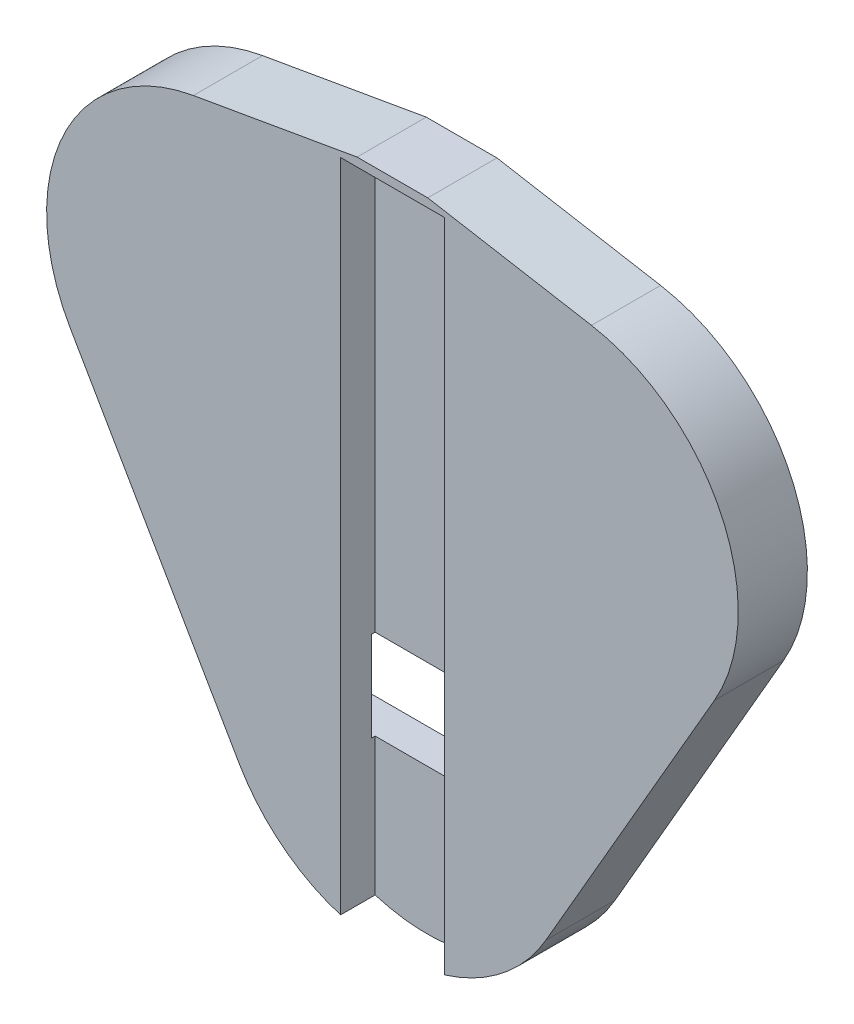
ISO-10303-21;
HEADER;
FILE_DESCRIPTION(('STEP AP214'),'2;1');
FILE_NAME('part.step','',(''),(''),'','','');
FILE_SCHEMA(('AUTOMOTIVE_DESIGN { 1 0 10303 214 1 1 1 1 }'));
ENDSEC;
DATA;
#1=APPLICATION_CONTEXT('core data for automotive mechanical design processes');
#2=APPLICATION_PROTOCOL_DEFINITION('international standard','automotive_design',2000,#1);
#3=PRODUCT_CONTEXT('',#1,'mechanical');
#4=PRODUCT('Part','Part','',(#3));
#5=PRODUCT_RELATED_PRODUCT_CATEGORY('part','',(#4));
#6=PRODUCT_DEFINITION_FORMATION('','',#4);
#7=PRODUCT_DEFINITION_CONTEXT('part definition',#1,'design');
#8=PRODUCT_DEFINITION('design','',#6,#7);
#9=PRODUCT_DEFINITION_SHAPE('','',#8);
#10=(LENGTH_UNIT() NAMED_UNIT(*) SI_UNIT(.MILLI.,.METRE.));
#11=(NAMED_UNIT(*) PLANE_ANGLE_UNIT() SI_UNIT($,.RADIAN.));
#12=(NAMED_UNIT(*) SI_UNIT($,.STERADIAN.) SOLID_ANGLE_UNIT());
#13=UNCERTAINTY_MEASURE_WITH_UNIT(LENGTH_MEASURE(1.E-05),#10,'distance_accuracy_value','');
#14=(GEOMETRIC_REPRESENTATION_CONTEXT(3) GLOBAL_UNCERTAINTY_ASSIGNED_CONTEXT((#13)) GLOBAL_UNIT_ASSIGNED_CONTEXT((#10,
#11,#12)) REPRESENTATION_CONTEXT('',''));
#15=CARTESIAN_POINT('',(0.,0.,0.));
#16=DIRECTION('',(0.,0.,1.));
#17=DIRECTION('',(1.,0.,0.));
#18=AXIS2_PLACEMENT_3D('',#15,#16,#17);
#19=CARTESIAN_POINT('',(0.,-21.5083302491977,-34.5));
#20=DIRECTION('',(0.,0.,1.));
#21=DIRECTION('',(1.,0.,0.));
#22=AXIS2_PLACEMENT_3D('',#19,#20,#21);
#23=PLANE('',#22);
#24=DIRECTION('',(-1.,0.,0.));
#25=VECTOR('',#24,1.);
#26=CARTESIAN_POINT('',(0.,-7.9,-34.5));
#27=LINE('',#26,#25);
#28=CARTESIAN_POINT('',(3.,-7.9,-34.5));
#29=VERTEX_POINT('',#28);
#30=CARTESIAN_POINT('',(-3.,-7.9,-34.5));
#31=VERTEX_POINT('',#30);
#32=EDGE_CURVE('E277',#29,#31,#27,.T.);
#33=ORIENTED_EDGE('',*,*,#32,.F.);
#34=DIRECTION('',(0.,1.,0.));
#35=VECTOR('',#34,1.);
#36=CARTESIAN_POINT('',(3.,-21.5083302491977,-34.5));
#37=LINE('',#36,#35);
#38=CARTESIAN_POINT('',(3.,16.8791651245989,-34.5));
#39=VERTEX_POINT('',#38);
#40=EDGE_CURVE('E296',#29,#39,#37,.T.);
#41=ORIENTED_EDGE('',*,*,#40,.T.);
#42=DIRECTION('',(-1.,0.,0.));
#43=VECTOR('',#42,1.);
#44=CARTESIAN_POINT('',(0.,16.8791651245989,-34.5));
#45=LINE('',#44,#43);
#46=CARTESIAN_POINT('',(-3.,16.8791651245989,-34.5));
#47=VERTEX_POINT('',#46);
#48=EDGE_CURVE('E286',#39,#47,#45,.T.);
#49=ORIENTED_EDGE('',*,*,#48,.T.);
#50=DIRECTION('',(0.,1.,0.));
#51=VECTOR('',#50,1.);
#52=CARTESIAN_POINT('',(-3.,-21.5083302491977,-34.5));
#53=LINE('',#52,#51);
#54=EDGE_CURVE('E289',#31,#47,#53,.T.);
#55=ORIENTED_EDGE('',*,*,#54,.F.);
#56=EDGE_LOOP('',(#33,#41,#49,#55));
#57=FACE_BOUND('',#56,.T.);
#58=ADVANCED_FACE('F39',(#57),#23,.T.);
#59=CARTESIAN_POINT('',(0.,-11.2583302491977,23.2874295558332));
#60=DIRECTION('',(0.,0.,-1.));
#61=DIRECTION('',(-1.,0.,0.));
#62=AXIS2_PLACEMENT_3D('',#59,#60,#61);
#63=CYLINDRICAL_SURFACE('',#62,10.25);
#64=CARTESIAN_POINT('',(0.,-11.2583302491977,-34.5));
#65=DIRECTION('',(0.,0.,1.));
#66=DIRECTION('',(1.,0.,0.));
#67=AXIS2_PLACEMENT_3D('',#64,#65,#66);
#68=CIRCLE('',#67,10.25);
#69=CARTESIAN_POINT('',(-3.,-21.059478141154,-34.5));
#70=VERTEX_POINT('',#69);
#71=CARTESIAN_POINT('',(3.,-21.059478141154,-34.5));
#72=VERTEX_POINT('',#71);
#73=EDGE_CURVE('E364',#70,#72,#68,.T.);
#74=ORIENTED_EDGE('',*,*,#73,.F.);
#75=DIRECTION('',(0.,0.,-1.));
#76=VECTOR('',#75,1.);
#77=CARTESIAN_POINT('',(-2.99999999999999,-21.059478141154,23.2874295558332));
#78=LINE('',#77,#76);
#79=CARTESIAN_POINT('',(-2.99999999999999,-21.059478141154,-32.5));
#80=VERTEX_POINT('',#79);
#81=EDGE_CURVE('E369',#70,#80,#78,.F.);
#82=ORIENTED_EDGE('',*,*,#81,.T.);
#83=CARTESIAN_POINT('',(0.,-11.2583302491977,-32.5));
#84=DIRECTION('',(0.,0.,1.));
#85=DIRECTION('',(1.,0.,0.));
#86=AXIS2_PLACEMENT_3D('',#83,#84,#85);
#87=CIRCLE('',#86,10.25);
#88=CARTESIAN_POINT('',(-8.8767603887905,-16.3833302491977,-32.5));
#89=VERTEX_POINT('',#88);
#90=EDGE_CURVE('E350',#89,#80,#87,.T.);
#91=ORIENTED_EDGE('',*,*,#90,.F.);
#92=DIRECTION('',(0.,0.,-1.));
#93=VECTOR('',#92,1.);
#94=CARTESIAN_POINT('',(-8.8767603887905,-16.3833302491977,23.2874295558332));
#95=LINE('',#94,#93);
#96=CARTESIAN_POINT('',(-8.8767603887905,-16.3833302491977,-36.5));
#97=VERTEX_POINT('',#96);
#98=EDGE_CURVE('E322',#89,#97,#95,.T.);
#99=ORIENTED_EDGE('',*,*,#98,.T.);
#100=CARTESIAN_POINT('',(0.,-11.2583302491977,-36.5));
#101=DIRECTION('',(0.,0.,1.));
#102=DIRECTION('',(1.,0.,0.));
#103=AXIS2_PLACEMENT_3D('',#100,#101,#102);
#104=CIRCLE('',#103,10.25);
#105=CARTESIAN_POINT('',(8.87676038879049,-16.3833302491977,-36.5));
#106=VERTEX_POINT('',#105);
#107=EDGE_CURVE('E318',#97,#106,#104,.T.);
#108=ORIENTED_EDGE('',*,*,#107,.T.);
#109=DIRECTION('',(0.,0.,-1.));
#110=VECTOR('',#109,1.);
#111=CARTESIAN_POINT('',(8.87676038879049,-16.3833302491977,23.2874295558332));
#112=LINE('',#111,#110);
#113=CARTESIAN_POINT('',(8.87676038879049,-16.3833302491977,-32.5));
#114=VERTEX_POINT('',#113);
#115=EDGE_CURVE('E326',#114,#106,#112,.T.);
#116=ORIENTED_EDGE('',*,*,#115,.F.);
#117=CARTESIAN_POINT('',(2.99999999999999,-21.059478141154,-32.5));
#118=VERTEX_POINT('',#117);
#119=EDGE_CURVE('E346',#118,#114,#87,.T.);
#120=ORIENTED_EDGE('',*,*,#119,.F.);
#121=DIRECTION('',(0.,0.,-1.));
#122=VECTOR('',#121,1.);
#123=CARTESIAN_POINT('',(2.99999999999999,-21.059478141154,23.2874295558332));
#124=LINE('',#123,#122);
#125=EDGE_CURVE('E366',#118,#72,#124,.T.);
#126=ORIENTED_EDGE('',*,*,#125,.T.);
#127=EDGE_LOOP('',(#74,#82,#91,#99,#108,#116,#120,#126));
#128=FACE_BOUND('',#127,.T.);
#129=ADVANCED_FACE('F394',(#128),#63,.T.);
#130=CARTESIAN_POINT('',(0.,0.,-32.5));
#131=DIRECTION('',(0.,0.,1.));
#132=DIRECTION('',(1.,0.,0.));
#133=AXIS2_PLACEMENT_3D('',#130,#131,#132);
#134=PLANE('',#133);
#135=DIRECTION('',(0.,1.,0.));
#136=VECTOR('',#135,1.);
#137=CARTESIAN_POINT('',(3.,0.,-32.5));
#138=LINE('',#137,#136);
#139=CARTESIAN_POINT('',(3.,16.8791651245989,-32.5));
#140=VERTEX_POINT('',#139);
#141=EDGE_CURVE('E301',#118,#140,#138,.T.);
#142=ORIENTED_EDGE('',*,*,#141,.F.);
#143=ORIENTED_EDGE('',*,*,#119,.T.);
#144=DIRECTION('',(0.5,0.866025403784439,0.));
#145=VECTOR('',#144,1.);
#146=CARTESIAN_POINT('',(13.7517603887905,-7.93958256229942,-32.5));
#147=LINE('',#146,#145);
#148=CARTESIAN_POINT('',(18.6267603887905,0.504165124598852,-32.5));
#149=VERTEX_POINT('',#148);
#150=EDGE_CURVE('E353',#114,#149,#147,.T.);
#151=ORIENTED_EDGE('',*,*,#150,.T.);
#152=CARTESIAN_POINT('',(9.75,5.62916512459887,-32.5));
#153=DIRECTION('',(0.,0.,1.));
#154=DIRECTION('',(1.,0.,0.));
#155=AXIS2_PLACEMENT_3D('',#152,#153,#154);
#156=CIRCLE('',#155,10.25);
#157=CARTESIAN_POINT('',(11.5123042934718,15.7265303045461,-32.5));
#158=VERTEX_POINT('',#157);
#159=EDGE_CURVE('E336',#149,#158,#156,.T.);
#160=ORIENTED_EDGE('',*,*,#159,.T.);
#161=DIRECTION('',(0.985108798043633,-0.171932126192369,0.));
#162=VECTOR('',#161,1.);
#163=CARTESIAN_POINT('',(3.00394280175114,17.2115040298747,-32.5));
#164=LINE('',#163,#162);
#165=CARTESIAN_POINT('',(2.04330546677387,17.3791651245989,-32.5));
#166=VERTEX_POINT('',#165);
#167=EDGE_CURVE('E316',#166,#158,#164,.T.);
#168=ORIENTED_EDGE('',*,*,#167,.F.);
#169=DIRECTION('',(1.,0.,0.));
#170=VECTOR('',#169,1.);
#171=CARTESIAN_POINT('',(0.,17.3791651245989,-32.5));
#172=LINE('',#171,#170);
#173=CARTESIAN_POINT('',(-2.04330546677387,17.3791651245989,-32.5));
#174=VERTEX_POINT('',#173);
#175=EDGE_CURVE('E307',#174,#166,#172,.T.);
#176=ORIENTED_EDGE('',*,*,#175,.F.);
#177=DIRECTION('',(-0.985108798043633,-0.17193212619237,0.));
#178=VECTOR('',#177,1.);
#179=CARTESIAN_POINT('',(-3.00394280175115,17.2115040298747,-32.5));
#180=LINE('',#179,#178);
#181=CARTESIAN_POINT('',(-11.5123042934718,15.7265303045461,-32.5));
#182=VERTEX_POINT('',#181);
#183=EDGE_CURVE('E303',#174,#182,#180,.T.);
#184=ORIENTED_EDGE('',*,*,#183,.T.);
#185=CARTESIAN_POINT('',(-9.75000000000001,5.62916512459888,-32.5));
#186=DIRECTION('',(0.,0.,1.));
#187=DIRECTION('',(1.,0.,0.));
#188=AXIS2_PLACEMENT_3D('',#185,#186,#187);
#189=CIRCLE('',#188,10.25);
#190=CARTESIAN_POINT('',(-18.6267603887905,0.504165124598869,-32.5));
#191=VERTEX_POINT('',#190);
#192=EDGE_CURVE('E344',#182,#191,#189,.T.);
#193=ORIENTED_EDGE('',*,*,#192,.T.);
#194=DIRECTION('',(-0.5,0.866025403784439,0.));
#195=VECTOR('',#194,1.);
#196=CARTESIAN_POINT('',(-13.7517603887905,-7.93958256229942,-32.5));
#197=LINE('',#196,#195);
#198=EDGE_CURVE('E321',#89,#191,#197,.T.);
#199=ORIENTED_EDGE('',*,*,#198,.F.);
#200=ORIENTED_EDGE('',*,*,#90,.T.);
#201=DIRECTION('',(0.,-1.,0.));
#202=VECTOR('',#201,1.);
#203=CARTESIAN_POINT('',(-3.,0.,-32.5));
#204=LINE('',#203,#202);
#205=CARTESIAN_POINT('',(-3.,16.8791651245989,-32.5));
#206=VERTEX_POINT('',#205);
#207=EDGE_CURVE('E295',#206,#80,#204,.T.);
#208=ORIENTED_EDGE('',*,*,#207,.F.);
#209=DIRECTION('',(1.,0.,0.));
#210=VECTOR('',#209,1.);
#211=CARTESIAN_POINT('',(0.,16.8791651245989,-32.5));
#212=LINE('',#211,#210);
#213=EDGE_CURVE('E372',#206,#140,#212,.T.);
#214=ORIENTED_EDGE('',*,*,#213,.T.);
#215=EDGE_LOOP('',(#142,#143,#151,#160,#168,#176,#184,#193,#199,#200,#208,#214));
#216=FACE_BOUND('',#215,.T.);
#217=ADVANCED_FACE('F41',(#216),#134,.T.);
#218=CARTESIAN_POINT('',(9.75,5.62916512459887,-36.5));
#219=DIRECTION('',(0.,0.,1.));
#220=DIRECTION('',(1.,0.,0.));
#221=AXIS2_PLACEMENT_3D('',#218,#219,#220);
#222=PLANE('',#221);
#223=DIRECTION('',(-1.,0.,0.));
#224=VECTOR('',#223,1.);
#225=CARTESIAN_POINT('',(0.,-13.1,-36.5));
#226=LINE('',#225,#224);
#227=CARTESIAN_POINT('',(9.1,-13.1,-36.5));
#228=VERTEX_POINT('',#227);
#229=CARTESIAN_POINT('',(-9.1,-13.1,-36.5));
#230=VERTEX_POINT('',#229);
#231=EDGE_CURVE('E243',#228,#230,#226,.T.);
#232=ORIENTED_EDGE('',*,*,#231,.F.);
#233=DIRECTION('',(0.,-1.,0.));
#234=VECTOR('',#233,1.);
#235=CARTESIAN_POINT('',(9.1,0.,-36.5));
#236=LINE('',#235,#234);
#237=CARTESIAN_POINT('',(9.1,-2.89999999999999,-36.5));
#238=VERTEX_POINT('',#237);
#239=EDGE_CURVE('E54',#238,#228,#236,.T.);
#240=ORIENTED_EDGE('',*,*,#239,.F.);
#241=DIRECTION('',(1.,0.,0.));
#242=VECTOR('',#241,1.);
#243=CARTESIAN_POINT('',(0.,-2.89999999999999,-36.5));
#244=LINE('',#243,#242);
#245=CARTESIAN_POINT('',(4.9,-2.89999999999999,-36.5));
#246=VERTEX_POINT('',#245);
#247=EDGE_CURVE('E224',#246,#238,#244,.T.);
#248=ORIENTED_EDGE('',*,*,#247,.F.);
#249=DIRECTION('',(0.,1.,0.));
#250=VECTOR('',#249,1.);
#251=CARTESIAN_POINT('',(4.9,0.,-36.5));
#252=LINE('',#251,#250);
#253=CARTESIAN_POINT('',(4.9,-7.9,-36.5));
#254=VERTEX_POINT('',#253);
#255=EDGE_CURVE('E227',#254,#246,#252,.T.);
#256=ORIENTED_EDGE('',*,*,#255,.F.);
#257=DIRECTION('',(1.,0.,0.));
#258=VECTOR('',#257,1.);
#259=CARTESIAN_POINT('',(0.,-7.9,-36.5));
#260=LINE('',#259,#258);
#261=CARTESIAN_POINT('',(-4.9,-7.9,-36.5));
#262=VERTEX_POINT('',#261);
#263=EDGE_CURVE('E254',#262,#254,#260,.T.);
#264=ORIENTED_EDGE('',*,*,#263,.F.);
#265=DIRECTION('',(0.,-1.,0.));
#266=VECTOR('',#265,1.);
#267=CARTESIAN_POINT('',(-4.9,0.,-36.5));
#268=LINE('',#267,#266);
#269=CARTESIAN_POINT('',(-4.9,-2.89999999999999,-36.5));
#270=VERTEX_POINT('',#269);
#271=EDGE_CURVE('E251',#270,#262,#268,.T.);
#272=ORIENTED_EDGE('',*,*,#271,.F.);
#273=DIRECTION('',(1.,0.,0.));
#274=VECTOR('',#273,1.);
#275=CARTESIAN_POINT('',(0.,-2.89999999999999,-36.5));
#276=LINE('',#275,#274);
#277=CARTESIAN_POINT('',(-9.1,-2.89999999999999,-36.5));
#278=VERTEX_POINT('',#277);
#279=EDGE_CURVE('E248',#278,#270,#276,.T.);
#280=ORIENTED_EDGE('',*,*,#279,.F.);
#281=DIRECTION('',(0.,1.,0.));
#282=VECTOR('',#281,1.);
#283=CARTESIAN_POINT('',(-9.1,0.,-36.5));
#284=LINE('',#283,#282);
#285=EDGE_CURVE('E245',#230,#278,#284,.T.);
#286=ORIENTED_EDGE('',*,*,#285,.F.);
#287=EDGE_LOOP('',(#232,#240,#248,#256,#264,#272,#280,#286));
#288=FACE_BOUND('',#287,.T.);
#289=DIRECTION('',(1.,0.,0.));
#290=VECTOR('',#289,1.);
#291=CARTESIAN_POINT('',(0.,17.3791651245989,-36.5));
#292=LINE('',#291,#290);
#293=CARTESIAN_POINT('',(-2.04330546677387,17.3791651245989,-36.5));
#294=VERTEX_POINT('',#293);
#295=CARTESIAN_POINT('',(2.04330546677387,17.3791651245989,-36.5));
#296=VERTEX_POINT('',#295);
#297=EDGE_CURVE('E333',#294,#296,#292,.T.);
#298=ORIENTED_EDGE('',*,*,#297,.T.);
#299=DIRECTION('',(0.985108798043633,-0.171932126192369,0.));
#300=VECTOR('',#299,1.);
#301=CARTESIAN_POINT('',(3.00394280175114,17.2115040298747,-36.5));
#302=LINE('',#301,#300);
#303=CARTESIAN_POINT('',(11.5123042934718,15.7265303045461,-36.5));
#304=VERTEX_POINT('',#303);
#305=EDGE_CURVE('E317',#296,#304,#302,.T.);
#306=ORIENTED_EDGE('',*,*,#305,.T.);
#307=CARTESIAN_POINT('',(9.75,5.62916512459887,-36.5));
#308=DIRECTION('',(0.,0.,1.));
#309=DIRECTION('',(1.,0.,0.));
#310=AXIS2_PLACEMENT_3D('',#307,#308,#309);
#311=CIRCLE('',#310,10.25);
#312=CARTESIAN_POINT('',(18.6267603887905,0.504165124598855,-36.5));
#313=VERTEX_POINT('',#312);
#314=EDGE_CURVE('E327',#313,#304,#311,.T.);
#315=ORIENTED_EDGE('',*,*,#314,.F.);
#316=DIRECTION('',(0.5,0.866025403784439,0.));
#317=VECTOR('',#316,1.);
#318=CARTESIAN_POINT('',(13.7517603887905,-7.93958256229942,-36.5));
#319=LINE('',#318,#317);
#320=EDGE_CURVE('E323',#106,#313,#319,.T.);
#321=ORIENTED_EDGE('',*,*,#320,.F.);
#322=ORIENTED_EDGE('',*,*,#107,.F.);
#323=DIRECTION('',(-0.5,0.866025403784439,0.));
#324=VECTOR('',#323,1.);
#325=CARTESIAN_POINT('',(-13.7517603887905,-7.93958256229942,-36.5));
#326=LINE('',#325,#324);
#327=CARTESIAN_POINT('',(-18.6267603887905,0.50416512459887,-36.5));
#328=VERTEX_POINT('',#327);
#329=EDGE_CURVE('E313',#97,#328,#326,.T.);
#330=ORIENTED_EDGE('',*,*,#329,.T.);
#331=CARTESIAN_POINT('',(-9.75000000000001,5.62916512459888,-36.5));
#332=DIRECTION('',(0.,0.,1.));
#333=DIRECTION('',(1.,0.,0.));
#334=AXIS2_PLACEMENT_3D('',#331,#332,#333);
#335=CIRCLE('',#334,10.25);
#336=CARTESIAN_POINT('',(-11.5123042934718,15.7265303045461,-36.5));
#337=VERTEX_POINT('',#336);
#338=EDGE_CURVE('E309',#337,#328,#335,.T.);
#339=ORIENTED_EDGE('',*,*,#338,.F.);
#340=DIRECTION('',(-0.985108798043633,-0.17193212619237,0.));
#341=VECTOR('',#340,1.);
#342=CARTESIAN_POINT('',(-3.00394280175115,17.2115040298747,-36.5));
#343=LINE('',#342,#341);
#344=EDGE_CURVE('E304',#294,#337,#343,.T.);
#345=ORIENTED_EDGE('',*,*,#344,.F.);
#346=EDGE_LOOP('',(#298,#306,#315,#321,#322,#330,#339,#345));
#347=FACE_BOUND('',#346,.T.);
#348=ADVANCED_FACE('F419',(#288,#347),#222,.F.);
#349=CARTESIAN_POINT('',(3.00394280175114,17.2115040298747,23.2874295558332));
#350=DIRECTION('',(0.171932126192369,0.985108798043633,0.));
#351=DIRECTION('',(-0.985108798043633,0.171932126192369,0.));
#352=AXIS2_PLACEMENT_3D('',#349,#350,#351);
#353=PLANE('',#352);
#354=DIRECTION('',(0.,0.,-1.));
#355=VECTOR('',#354,1.);
#356=CARTESIAN_POINT('',(2.04330546677387,17.3791651245989,23.2874295558332));
#357=LINE('',#356,#355);
#358=EDGE_CURVE('E342',#166,#296,#357,.T.);
#359=ORIENTED_EDGE('',*,*,#358,.F.);
#360=ORIENTED_EDGE('',*,*,#167,.T.);
#361=DIRECTION('',(0.,0.,-1.));
#362=VECTOR('',#361,1.);
#363=CARTESIAN_POINT('',(11.5123042934718,15.7265303045461,23.2874295558332));
#364=LINE('',#363,#362);
#365=EDGE_CURVE('E339',#158,#304,#364,.T.);
#366=ORIENTED_EDGE('',*,*,#365,.T.);
#367=ORIENTED_EDGE('',*,*,#305,.F.);
#368=EDGE_LOOP('',(#359,#360,#366,#367));
#369=FACE_BOUND('',#368,.T.);
#370=ADVANCED_FACE('F459',(#369),#353,.T.);
#371=CARTESIAN_POINT('',(9.75,5.62916512459887,23.2874295558332));
#372=DIRECTION('',(0.,0.,-1.));
#373=DIRECTION('',(-1.,0.,0.));
#374=AXIS2_PLACEMENT_3D('',#371,#372,#373);
#375=CYLINDRICAL_SURFACE('',#374,10.25);
#376=ORIENTED_EDGE('',*,*,#159,.F.);
#377=DIRECTION('',(0.,0.,-1.));
#378=VECTOR('',#377,1.);
#379=CARTESIAN_POINT('',(18.6267603887905,0.504165124598855,23.2874295558332));
#380=LINE('',#379,#378);
#381=EDGE_CURVE('E330',#149,#313,#380,.T.);
#382=ORIENTED_EDGE('',*,*,#381,.T.);
#383=ORIENTED_EDGE('',*,*,#314,.T.);
#384=ORIENTED_EDGE('',*,*,#365,.F.);
#385=EDGE_LOOP('',(#376,#382,#383,#384));
#386=FACE_BOUND('',#385,.T.);
#387=ADVANCED_FACE('F463',(#386),#375,.T.);
#388=CARTESIAN_POINT('',(13.7517603887905,-7.93958256229942,23.2874295558332));
#389=DIRECTION('',(-0.866025403784439,0.5,0.));
#390=DIRECTION('',(-0.5,-0.866025403784439,0.));
#391=AXIS2_PLACEMENT_3D('',#388,#389,#390);
#392=PLANE('',#391);
#393=ORIENTED_EDGE('',*,*,#150,.F.);
#394=ORIENTED_EDGE('',*,*,#115,.T.);
#395=ORIENTED_EDGE('',*,*,#320,.T.);
#396=ORIENTED_EDGE('',*,*,#381,.F.);
#397=EDGE_LOOP('',(#393,#394,#395,#396));
#398=FACE_BOUND('',#397,.T.);
#399=ADVANCED_FACE('F465',(#398),#392,.F.);
#400=CARTESIAN_POINT('',(-13.7517603887905,-7.93958256229942,23.2874295558332));
#401=DIRECTION('',(-0.866025403784439,-0.5,0.));
#402=DIRECTION('',(0.5,-0.866025403784439,0.));
#403=AXIS2_PLACEMENT_3D('',#400,#401,#402);
#404=PLANE('',#403);
#405=ORIENTED_EDGE('',*,*,#98,.F.);
#406=ORIENTED_EDGE('',*,*,#198,.T.);
#407=DIRECTION('',(0.,0.,-1.));
#408=VECTOR('',#407,1.);
#409=CARTESIAN_POINT('',(-18.6267603887905,0.50416512459887,23.2874295558332));
#410=LINE('',#409,#408);
#411=EDGE_CURVE('E349',#191,#328,#410,.T.);
#412=ORIENTED_EDGE('',*,*,#411,.T.);
#413=ORIENTED_EDGE('',*,*,#329,.F.);
#414=EDGE_LOOP('',(#405,#406,#412,#413));
#415=FACE_BOUND('',#414,.T.);
#416=ADVANCED_FACE('F443',(#415),#404,.T.);
#417=CARTESIAN_POINT('',(-9.75000000000001,5.62916512459888,23.2874295558332));
#418=DIRECTION('',(0.,0.,-1.));
#419=DIRECTION('',(-1.,0.,0.));
#420=AXIS2_PLACEMENT_3D('',#417,#418,#419);
#421=CYLINDRICAL_SURFACE('',#420,10.25);
#422=ORIENTED_EDGE('',*,*,#192,.F.);
#423=DIRECTION('',(0.,0.,-1.));
#424=VECTOR('',#423,1.);
#425=CARTESIAN_POINT('',(-11.5123042934718,15.7265303045461,23.2874295558332));
#426=LINE('',#425,#424);
#427=EDGE_CURVE('E312',#182,#337,#426,.T.);
#428=ORIENTED_EDGE('',*,*,#427,.T.);
#429=ORIENTED_EDGE('',*,*,#338,.T.);
#430=ORIENTED_EDGE('',*,*,#411,.F.);
#431=EDGE_LOOP('',(#422,#428,#429,#430));
#432=FACE_BOUND('',#431,.T.);
#433=ADVANCED_FACE('F447',(#432),#421,.T.);
#434=CARTESIAN_POINT('',(-3.00394280175115,17.2115040298747,23.2874295558332));
#435=DIRECTION('',(0.17193212619237,-0.985108798043633,0.));
#436=DIRECTION('',(0.985108798043633,0.17193212619237,0.));
#437=AXIS2_PLACEMENT_3D('',#434,#435,#436);
#438=PLANE('',#437);
#439=ORIENTED_EDGE('',*,*,#183,.F.);
#440=DIRECTION('',(0.,0.,-1.));
#441=VECTOR('',#440,1.);
#442=CARTESIAN_POINT('',(-2.04330546677387,17.3791651245989,23.2874295558332));
#443=LINE('',#442,#441);
#444=EDGE_CURVE('E308',#174,#294,#443,.T.);
#445=ORIENTED_EDGE('',*,*,#444,.T.);
#446=ORIENTED_EDGE('',*,*,#344,.T.);
#447=ORIENTED_EDGE('',*,*,#427,.F.);
#448=EDGE_LOOP('',(#439,#445,#446,#447));
#449=FACE_BOUND('',#448,.T.);
#450=ADVANCED_FACE('F490',(#449),#438,.F.);
#451=CARTESIAN_POINT('',(0.,17.3791651245989,23.2874295558332));
#452=DIRECTION('',(0.,1.,0.));
#453=DIRECTION('',(0.,0.,1.));
#454=AXIS2_PLACEMENT_3D('',#451,#452,#453);
#455=PLANE('',#454);
#456=ORIENTED_EDGE('',*,*,#444,.F.);
#457=ORIENTED_EDGE('',*,*,#175,.T.);
#458=ORIENTED_EDGE('',*,*,#358,.T.);
#459=ORIENTED_EDGE('',*,*,#297,.F.);
#460=EDGE_LOOP('',(#456,#457,#458,#459));
#461=FACE_BOUND('',#460,.T.);
#462=ADVANCED_FACE('F454',(#461),#455,.T.);
#463=DIRECTION('',(1.,0.,0.));
#464=VECTOR('',#463,1.);
#465=CARTESIAN_POINT('',(0.,-13.1,-34.5));
#466=LINE('',#465,#464);
#467=CARTESIAN_POINT('',(-3.,-13.1,-34.5));
#468=VERTEX_POINT('',#467);
#469=CARTESIAN_POINT('',(3.,-13.1,-34.5));
#470=VERTEX_POINT('',#469);
#471=EDGE_CURVE('E274',#468,#470,#466,.T.);
#472=ORIENTED_EDGE('',*,*,#471,.F.);
#473=EDGE_CURVE('E297',#70,#468,#53,.T.);
#474=ORIENTED_EDGE('',*,*,#473,.F.);
#475=ORIENTED_EDGE('',*,*,#73,.T.);
#476=EDGE_CURVE('E292',#72,#470,#37,.T.);
#477=ORIENTED_EDGE('',*,*,#476,.T.);
#478=EDGE_LOOP('',(#472,#474,#475,#477));
#479=FACE_BOUND('',#478,.T.);
#480=ADVANCED_FACE('F386',(#479),#23,.T.);
#481=CARTESIAN_POINT('',(2.99999999999999,-21.5083302491977,0.));
#482=DIRECTION('',(1.,0.,0.));
#483=DIRECTION('',(0.,0.,-1.));
#484=AXIS2_PLACEMENT_3D('',#481,#482,#483);
#485=PLANE('',#484);
#486=ORIENTED_EDGE('',*,*,#40,.F.);
#487=DIRECTION('',(0.,0.,1.));
#488=VECTOR('',#487,1.);
#489=CARTESIAN_POINT('',(2.99999999999999,-7.9,0.));
#490=LINE('',#489,#488);
#491=CARTESIAN_POINT('',(3.,-7.9,-34.3));
#492=VERTEX_POINT('',#491);
#493=EDGE_CURVE('E279',#29,#492,#490,.T.);
#494=ORIENTED_EDGE('',*,*,#493,.T.);
#495=DIRECTION('',(0.,1.,0.));
#496=VECTOR('',#495,1.);
#497=CARTESIAN_POINT('',(3.,-21.5083302491977,-34.3));
#498=LINE('',#497,#496);
#499=CARTESIAN_POINT('',(3.,-13.1,-34.3));
#500=VERTEX_POINT('',#499);
#501=EDGE_CURVE('E261',#500,#492,#498,.T.);
#502=ORIENTED_EDGE('',*,*,#501,.F.);
#503=DIRECTION('',(0.,0.,-1.));
#504=VECTOR('',#503,1.);
#505=CARTESIAN_POINT('',(2.99999999999999,-13.1,0.));
#506=LINE('',#505,#504);
#507=EDGE_CURVE('E215',#500,#470,#506,.T.);
#508=ORIENTED_EDGE('',*,*,#507,.T.);
#509=ORIENTED_EDGE('',*,*,#476,.F.);
#510=ORIENTED_EDGE('',*,*,#125,.F.);
#511=ORIENTED_EDGE('',*,*,#141,.T.);
#512=DIRECTION('',(0.,0.,1.));
#513=VECTOR('',#512,1.);
#514=CARTESIAN_POINT('',(2.99999999999999,16.8791651245989,0.));
#515=LINE('',#514,#513);
#516=EDGE_CURVE('E282',#39,#140,#515,.T.);
#517=ORIENTED_EDGE('',*,*,#516,.F.);
#518=EDGE_LOOP('',(#486,#494,#502,#508,#509,#510,#511,#517));
#519=FACE_BOUND('',#518,.T.);
#520=ADVANCED_FACE('F390',(#519),#485,.F.);
#521=CARTESIAN_POINT('',(-2.99999999999999,-21.5083302491977,0.));
#522=DIRECTION('',(-1.,0.,0.));
#523=DIRECTION('',(0.,0.,1.));
#524=AXIS2_PLACEMENT_3D('',#521,#522,#523);
#525=PLANE('',#524);
#526=DIRECTION('',(0.,-1.,0.));
#527=VECTOR('',#526,1.);
#528=CARTESIAN_POINT('',(-3.,-21.5083302491977,-34.3));
#529=LINE('',#528,#527);
#530=CARTESIAN_POINT('',(-3.,-7.9,-34.3));
#531=VERTEX_POINT('',#530);
#532=CARTESIAN_POINT('',(-3.,-13.1,-34.3));
#533=VERTEX_POINT('',#532);
#534=EDGE_CURVE('E375',#531,#533,#529,.T.);
#535=ORIENTED_EDGE('',*,*,#534,.F.);
#536=DIRECTION('',(0.,0.,-1.));
#537=VECTOR('',#536,1.);
#538=CARTESIAN_POINT('',(-2.99999999999999,-7.9,0.));
#539=LINE('',#538,#537);
#540=EDGE_CURVE('E11',#531,#31,#539,.T.);
#541=ORIENTED_EDGE('',*,*,#540,.T.);
#542=ORIENTED_EDGE('',*,*,#54,.T.);
#543=DIRECTION('',(0.,0.,-1.));
#544=VECTOR('',#543,1.);
#545=CARTESIAN_POINT('',(-2.99999999999999,16.8791651245989,0.));
#546=LINE('',#545,#544);
#547=EDGE_CURVE('E283',#206,#47,#546,.T.);
#548=ORIENTED_EDGE('',*,*,#547,.F.);
#549=ORIENTED_EDGE('',*,*,#207,.T.);
#550=ORIENTED_EDGE('',*,*,#81,.F.);
#551=ORIENTED_EDGE('',*,*,#473,.T.);
#552=DIRECTION('',(0.,0.,1.));
#553=VECTOR('',#552,1.);
#554=CARTESIAN_POINT('',(-2.99999999999999,-13.1,0.));
#555=LINE('',#554,#553);
#556=EDGE_CURVE('E47',#468,#533,#555,.T.);
#557=ORIENTED_EDGE('',*,*,#556,.T.);
#558=EDGE_LOOP('',(#535,#541,#542,#548,#549,#550,#551,#557));
#559=FACE_BOUND('',#558,.T.);
#560=ADVANCED_FACE('F379',(#559),#525,.F.);
#561=CARTESIAN_POINT('',(0.,16.8791651245989,-92.2874295558332));
#562=DIRECTION('',(0.,-1.,0.));
#563=DIRECTION('',(0.,0.,-1.));
#564=AXIS2_PLACEMENT_3D('',#561,#562,#563);
#565=PLANE('',#564);
#566=ORIENTED_EDGE('',*,*,#547,.T.);
#567=ORIENTED_EDGE('',*,*,#48,.F.);
#568=ORIENTED_EDGE('',*,*,#516,.T.);
#569=ORIENTED_EDGE('',*,*,#213,.F.);
#570=EDGE_LOOP('',(#566,#567,#568,#569));
#571=FACE_BOUND('',#570,.T.);
#572=ADVANCED_FACE('F403',(#571),#565,.T.);
#573=CARTESIAN_POINT('',(0.,-7.9,-34.3));
#574=DIRECTION('',(0.,1.,0.));
#575=DIRECTION('',(0.,0.,1.));
#576=AXIS2_PLACEMENT_3D('',#573,#574,#575);
#577=PLANE('',#576);
#578=ORIENTED_EDGE('',*,*,#32,.T.);
#579=ORIENTED_EDGE('',*,*,#540,.F.);
#580=DIRECTION('',(1.,0.,0.));
#581=VECTOR('',#580,1.);
#582=CARTESIAN_POINT('',(0.,-7.9,-34.3));
#583=LINE('',#582,#581);
#584=CARTESIAN_POINT('',(-4.9,-7.9,-34.3));
#585=VERTEX_POINT('',#584);
#586=EDGE_CURVE('E62',#585,#531,#583,.T.);
#587=ORIENTED_EDGE('',*,*,#586,.F.);
#588=DIRECTION('',(0.,0.,-1.));
#589=VECTOR('',#588,1.);
#590=CARTESIAN_POINT('',(-4.9,-7.9,-34.3));
#591=LINE('',#590,#589);
#592=EDGE_CURVE('E266',#585,#262,#591,.T.);
#593=ORIENTED_EDGE('',*,*,#592,.T.);
#594=ORIENTED_EDGE('',*,*,#263,.T.);
#595=DIRECTION('',(0.,0.,-1.));
#596=VECTOR('',#595,1.);
#597=CARTESIAN_POINT('',(4.9,-7.9,-34.3));
#598=LINE('',#597,#596);
#599=CARTESIAN_POINT('',(4.9,-7.9,-34.3));
#600=VERTEX_POINT('',#599);
#601=EDGE_CURVE('E264',#600,#254,#598,.T.);
#602=ORIENTED_EDGE('',*,*,#601,.F.);
#603=EDGE_CURVE('E237',#492,#600,#583,.T.);
#604=ORIENTED_EDGE('',*,*,#603,.F.);
#605=ORIENTED_EDGE('',*,*,#493,.F.);
#606=EDGE_LOOP('',(#578,#579,#587,#593,#594,#602,#604,#605));
#607=FACE_BOUND('',#606,.T.);
#608=ADVANCED_FACE('F410',(#607),#577,.F.);
#609=CARTESIAN_POINT('',(0.,-13.1,-34.3));
#610=DIRECTION('',(0.,-1.,0.));
#611=DIRECTION('',(0.,0.,-1.));
#612=AXIS2_PLACEMENT_3D('',#609,#610,#611);
#613=PLANE('',#612);
#614=DIRECTION('',(-1.,0.,0.));
#615=VECTOR('',#614,1.);
#616=CARTESIAN_POINT('',(0.,-13.1,-34.3));
#617=LINE('',#616,#615);
#618=CARTESIAN_POINT('',(9.1,-13.1,-34.3));
#619=VERTEX_POINT('',#618);
#620=EDGE_CURVE('E212',#619,#500,#617,.T.);
#621=ORIENTED_EDGE('',*,*,#620,.F.);
#622=DIRECTION('',(0.,0.,-1.));
#623=VECTOR('',#622,1.);
#624=CARTESIAN_POINT('',(9.1,-13.1,-34.3));
#625=LINE('',#624,#623);
#626=EDGE_CURVE('E199',#619,#228,#625,.T.);
#627=ORIENTED_EDGE('',*,*,#626,.T.);
#628=ORIENTED_EDGE('',*,*,#231,.T.);
#629=DIRECTION('',(0.,0.,-1.));
#630=VECTOR('',#629,1.);
#631=CARTESIAN_POINT('',(-9.1,-13.1,-34.3));
#632=LINE('',#631,#630);
#633=CARTESIAN_POINT('',(-9.1,-13.1,-34.3));
#634=VERTEX_POINT('',#633);
#635=EDGE_CURVE('E208',#634,#230,#632,.T.);
#636=ORIENTED_EDGE('',*,*,#635,.F.);
#637=EDGE_CURVE('E219',#533,#634,#617,.T.);
#638=ORIENTED_EDGE('',*,*,#637,.F.);
#639=ORIENTED_EDGE('',*,*,#556,.F.);
#640=ORIENTED_EDGE('',*,*,#471,.T.);
#641=ORIENTED_EDGE('',*,*,#507,.F.);
#642=EDGE_LOOP('',(#621,#627,#628,#636,#638,#639,#640,#641));
#643=FACE_BOUND('',#642,.T.);
#644=ADVANCED_FACE('F213',(#643),#613,.F.);
#645=CARTESIAN_POINT('',(0.,0.,-34.3));
#646=DIRECTION('',(0.,0.,-1.));
#647=DIRECTION('',(-1.,0.,0.));
#648=AXIS2_PLACEMENT_3D('',#645,#646,#647);
#649=PLANE('',#648);
#650=ORIENTED_EDGE('',*,*,#501,.T.);
#651=ORIENTED_EDGE('',*,*,#603,.T.);
#652=DIRECTION('',(0.,1.,0.));
#653=VECTOR('',#652,1.);
#654=CARTESIAN_POINT('',(4.9,0.,-34.3));
#655=LINE('',#654,#653);
#656=CARTESIAN_POINT('',(4.9,-2.89999999999999,-34.3));
#657=VERTEX_POINT('',#656);
#658=EDGE_CURVE('E239',#600,#657,#655,.T.);
#659=ORIENTED_EDGE('',*,*,#658,.T.);
#660=DIRECTION('',(1.,0.,0.));
#661=VECTOR('',#660,1.);
#662=CARTESIAN_POINT('',(0.,-2.89999999999999,-34.3));
#663=LINE('',#662,#661);
#664=CARTESIAN_POINT('',(9.1,-2.89999999999999,-34.3));
#665=VERTEX_POINT('',#664);
#666=EDGE_CURVE('E209',#657,#665,#663,.T.);
#667=ORIENTED_EDGE('',*,*,#666,.T.);
#668=DIRECTION('',(0.,-1.,0.));
#669=VECTOR('',#668,1.);
#670=CARTESIAN_POINT('',(9.1,0.,-34.3));
#671=LINE('',#670,#669);
#672=EDGE_CURVE('E203',#665,#619,#671,.T.);
#673=ORIENTED_EDGE('',*,*,#672,.T.);
#674=ORIENTED_EDGE('',*,*,#620,.T.);
#675=EDGE_LOOP('',(#650,#651,#659,#667,#673,#674));
#676=FACE_BOUND('',#675,.T.);
#677=ADVANCED_FACE('F221',(#676),#649,.T.);
#678=ORIENTED_EDGE('',*,*,#534,.T.);
#679=ORIENTED_EDGE('',*,*,#637,.T.);
#680=DIRECTION('',(0.,1.,0.));
#681=VECTOR('',#680,1.);
#682=CARTESIAN_POINT('',(-9.1,0.,-34.3));
#683=LINE('',#682,#681);
#684=CARTESIAN_POINT('',(-9.1,-2.89999999999999,-34.3));
#685=VERTEX_POINT('',#684);
#686=EDGE_CURVE('E218',#634,#685,#683,.T.);
#687=ORIENTED_EDGE('',*,*,#686,.T.);
#688=DIRECTION('',(1.,0.,0.));
#689=VECTOR('',#688,1.);
#690=CARTESIAN_POINT('',(0.,-2.89999999999999,-34.3));
#691=LINE('',#690,#689);
#692=CARTESIAN_POINT('',(-4.9,-2.89999999999999,-34.3));
#693=VERTEX_POINT('',#692);
#694=EDGE_CURVE('E232',#685,#693,#691,.T.);
#695=ORIENTED_EDGE('',*,*,#694,.T.);
#696=DIRECTION('',(0.,-1.,0.));
#697=VECTOR('',#696,1.);
#698=CARTESIAN_POINT('',(-4.9,0.,-34.3));
#699=LINE('',#698,#697);
#700=EDGE_CURVE('E235',#693,#585,#699,.T.);
#701=ORIENTED_EDGE('',*,*,#700,.T.);
#702=ORIENTED_EDGE('',*,*,#586,.T.);
#703=EDGE_LOOP('',(#678,#679,#687,#695,#701,#702));
#704=FACE_BOUND('',#703,.T.);
#705=ADVANCED_FACE('F427',(#704),#649,.T.);
#706=CARTESIAN_POINT('',(9.1,0.,-34.3));
#707=DIRECTION('',(1.,0.,0.));
#708=DIRECTION('',(0.,0.,-1.));
#709=AXIS2_PLACEMENT_3D('',#706,#707,#708);
#710=PLANE('',#709);
#711=ORIENTED_EDGE('',*,*,#239,.T.);
#712=ORIENTED_EDGE('',*,*,#626,.F.);
#713=ORIENTED_EDGE('',*,*,#672,.F.);
#714=DIRECTION('',(0.,0.,-1.));
#715=VECTOR('',#714,1.);
#716=CARTESIAN_POINT('',(9.1,-2.89999999999999,-34.3));
#717=LINE('',#716,#715);
#718=EDGE_CURVE('E259',#665,#238,#717,.T.);
#719=ORIENTED_EDGE('',*,*,#718,.T.);
#720=EDGE_LOOP('',(#711,#712,#713,#719));
#721=FACE_BOUND('',#720,.T.);
#722=ADVANCED_FACE('F201',(#721),#710,.F.);
#723=CARTESIAN_POINT('',(0.,-2.89999999999999,-34.3));
#724=DIRECTION('',(0.,1.,0.));
#725=DIRECTION('',(0.,0.,1.));
#726=AXIS2_PLACEMENT_3D('',#723,#724,#725);
#727=PLANE('',#726);
#728=ORIENTED_EDGE('',*,*,#247,.T.);
#729=ORIENTED_EDGE('',*,*,#718,.F.);
#730=ORIENTED_EDGE('',*,*,#666,.F.);
#731=DIRECTION('',(0.,0.,-1.));
#732=VECTOR('',#731,1.);
#733=CARTESIAN_POINT('',(4.9,-2.89999999999999,-34.3));
#734=LINE('',#733,#732);
#735=EDGE_CURVE('E262',#657,#246,#734,.T.);
#736=ORIENTED_EDGE('',*,*,#735,.T.);
#737=EDGE_LOOP('',(#728,#729,#730,#736));
#738=FACE_BOUND('',#737,.T.);
#739=ADVANCED_FACE('F415',(#738),#727,.F.);
#740=CARTESIAN_POINT('',(4.9,0.,-34.3));
#741=DIRECTION('',(-1.,0.,0.));
#742=DIRECTION('',(0.,0.,1.));
#743=AXIS2_PLACEMENT_3D('',#740,#741,#742);
#744=PLANE('',#743);
#745=ORIENTED_EDGE('',*,*,#255,.T.);
#746=ORIENTED_EDGE('',*,*,#735,.F.);
#747=ORIENTED_EDGE('',*,*,#658,.F.);
#748=ORIENTED_EDGE('',*,*,#601,.T.);
#749=EDGE_LOOP('',(#745,#746,#747,#748));
#750=FACE_BOUND('',#749,.T.);
#751=ADVANCED_FACE('F594',(#750),#744,.F.);
#752=CARTESIAN_POINT('',(-4.9,0.,-34.3));
#753=DIRECTION('',(1.,0.,0.));
#754=DIRECTION('',(0.,0.,-1.));
#755=AXIS2_PLACEMENT_3D('',#752,#753,#754);
#756=PLANE('',#755);
#757=ORIENTED_EDGE('',*,*,#271,.T.);
#758=ORIENTED_EDGE('',*,*,#592,.F.);
#759=ORIENTED_EDGE('',*,*,#700,.F.);
#760=DIRECTION('',(0.,0.,-1.));
#761=VECTOR('',#760,1.);
#762=CARTESIAN_POINT('',(-4.9,-2.89999999999999,-34.3));
#763=LINE('',#762,#761);
#764=EDGE_CURVE('E268',#693,#270,#763,.T.);
#765=ORIENTED_EDGE('',*,*,#764,.T.);
#766=EDGE_LOOP('',(#757,#758,#759,#765));
#767=FACE_BOUND('',#766,.T.);
#768=ADVANCED_FACE('F433',(#767),#756,.F.);
#769=CARTESIAN_POINT('',(0.,-2.89999999999999,-34.3));
#770=DIRECTION('',(0.,1.,0.));
#771=DIRECTION('',(0.,0.,1.));
#772=AXIS2_PLACEMENT_3D('',#769,#770,#771);
#773=PLANE('',#772);
#774=ORIENTED_EDGE('',*,*,#279,.T.);
#775=ORIENTED_EDGE('',*,*,#764,.F.);
#776=ORIENTED_EDGE('',*,*,#694,.F.);
#777=DIRECTION('',(0.,0.,-1.));
#778=VECTOR('',#777,1.);
#779=CARTESIAN_POINT('',(-9.1,-2.89999999999999,-34.3));
#780=LINE('',#779,#778);
#781=EDGE_CURVE('E270',#685,#278,#780,.T.);
#782=ORIENTED_EDGE('',*,*,#781,.T.);
#783=EDGE_LOOP('',(#774,#775,#776,#782));
#784=FACE_BOUND('',#783,.T.);
#785=ADVANCED_FACE('F430',(#784),#773,.F.);
#786=CARTESIAN_POINT('',(-9.1,0.,-34.3));
#787=DIRECTION('',(-1.,0.,0.));
#788=DIRECTION('',(0.,0.,1.));
#789=AXIS2_PLACEMENT_3D('',#786,#787,#788);
#790=PLANE('',#789);
#791=ORIENTED_EDGE('',*,*,#285,.T.);
#792=ORIENTED_EDGE('',*,*,#781,.F.);
#793=ORIENTED_EDGE('',*,*,#686,.F.);
#794=ORIENTED_EDGE('',*,*,#635,.T.);
#795=EDGE_LOOP('',(#791,#792,#793,#794));
#796=FACE_BOUND('',#795,.T.);
#797=ADVANCED_FACE('F425',(#796),#790,.F.);
#798=CLOSED_SHELL('',(#58,#129,#217,#348,#370,#387,#399,#416,#433,#450,#462,#480,#520,#560,#572,
#608,#644,#677,#705,#722,#739,#751,#768,#785,#797));
#799=MANIFOLD_SOLID_BREP('B2',#798);
#800=ADVANCED_BREP_SHAPE_REPRESENTATION('',(#18,#799),#14);
#801=SHAPE_DEFINITION_REPRESENTATION(#9,#800);
ENDSEC;
END-ISO-10303-21;
